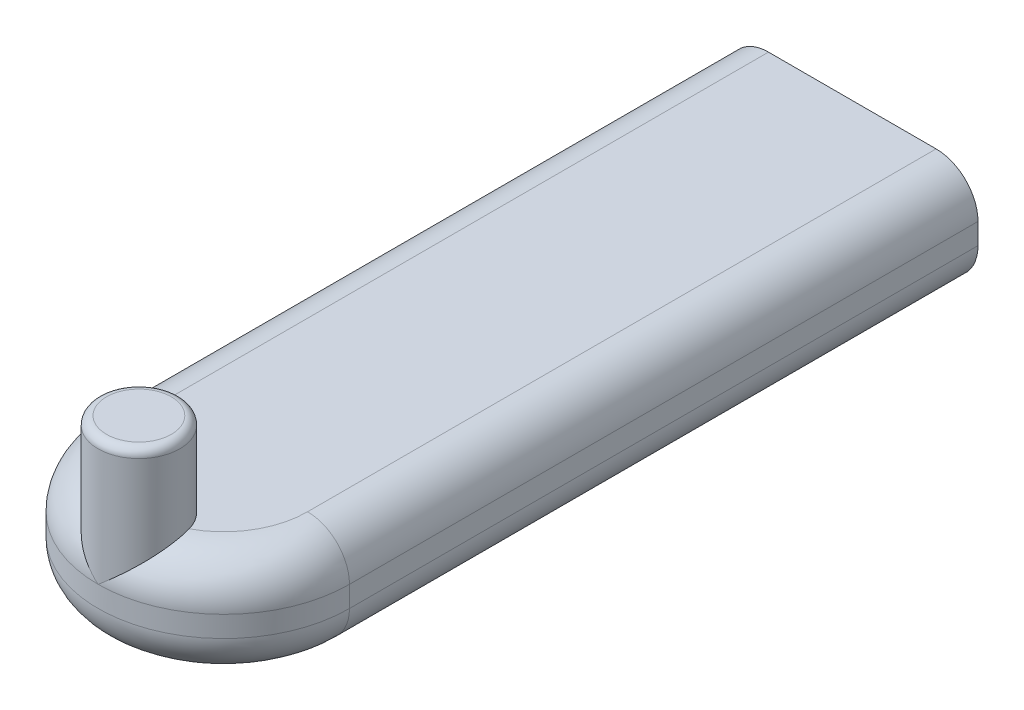
ISO-10303-21;
HEADER;
FILE_DESCRIPTION(('STEP AP214'),'2;1');
FILE_NAME('part.step','',(''),(''),'','','');
FILE_SCHEMA(('AUTOMOTIVE_DESIGN { 1 0 10303 214 1 1 1 1 }'));
ENDSEC;
DATA;
#1=APPLICATION_CONTEXT('core data for automotive mechanical design processes');
#2=APPLICATION_PROTOCOL_DEFINITION('international standard','automotive_design',2000,#1);
#3=PRODUCT_CONTEXT('',#1,'mechanical');
#4=PRODUCT('Part','Part','',(#3));
#5=PRODUCT_RELATED_PRODUCT_CATEGORY('part','',(#4));
#6=PRODUCT_DEFINITION_FORMATION('','',#4);
#7=PRODUCT_DEFINITION_CONTEXT('part definition',#1,'design');
#8=PRODUCT_DEFINITION('design','',#6,#7);
#9=PRODUCT_DEFINITION_SHAPE('','',#8);
#10=(LENGTH_UNIT() NAMED_UNIT(*) SI_UNIT(.MILLI.,.METRE.));
#11=(NAMED_UNIT(*) PLANE_ANGLE_UNIT() SI_UNIT($,.RADIAN.));
#12=(NAMED_UNIT(*) SI_UNIT($,.STERADIAN.) SOLID_ANGLE_UNIT());
#13=UNCERTAINTY_MEASURE_WITH_UNIT(LENGTH_MEASURE(1.E-05),#10,'distance_accuracy_value','');
#14=(GEOMETRIC_REPRESENTATION_CONTEXT(3) GLOBAL_UNCERTAINTY_ASSIGNED_CONTEXT((#13)) GLOBAL_UNIT_ASSIGNED_CONTEXT((#10,
#11,#12)) REPRESENTATION_CONTEXT('',''));
#15=CARTESIAN_POINT('',(0.,0.,0.));
#16=DIRECTION('',(0.,0.,1.));
#17=DIRECTION('',(1.,0.,0.));
#18=AXIS2_PLACEMENT_3D('',#15,#16,#17);
#19=CARTESIAN_POINT('',(0.,5.,0.));
#20=DIRECTION('',(0.,-1.,0.));
#21=DIRECTION('',(0.,0.,-1.));
#22=AXIS2_PLACEMENT_3D('',#19,#20,#21);
#23=CYLINDRICAL_SURFACE('',#22,6.);
#24=DIRECTION('',(0.,-1.,0.));
#25=VECTOR('',#24,1.);
#26=CARTESIAN_POINT('',(-6.,5.,0.));
#27=LINE('',#26,#25);
#28=CARTESIAN_POINT('',(-6.,3.,0.));
#29=VERTEX_POINT('',#28);
#30=CARTESIAN_POINT('',(-6.,2.,0.));
#31=VERTEX_POINT('',#30);
#32=EDGE_CURVE('E250',#29,#31,#27,.T.);
#33=ORIENTED_EDGE('',*,*,#32,.T.);
#34=CARTESIAN_POINT('',(0.,2.,0.));
#35=DIRECTION('',(0.,1.,0.));
#36=DIRECTION('',(0.,0.,1.));
#37=AXIS2_PLACEMENT_3D('',#34,#35,#36);
#38=CIRCLE('',#37,6.);
#39=CARTESIAN_POINT('',(6.,2.,0.));
#40=VERTEX_POINT('',#39);
#41=EDGE_CURVE('E128',#31,#40,#38,.T.);
#42=ORIENTED_EDGE('',*,*,#41,.T.);
#43=DIRECTION('',(0.,-1.,0.));
#44=VECTOR('',#43,1.);
#45=CARTESIAN_POINT('',(6.,5.,0.));
#46=LINE('',#45,#44);
#47=CARTESIAN_POINT('',(6.,3.,0.));
#48=VERTEX_POINT('',#47);
#49=EDGE_CURVE('E116',#48,#40,#46,.T.);
#50=ORIENTED_EDGE('',*,*,#49,.F.);
#51=CARTESIAN_POINT('',(0.,3.,0.));
#52=DIRECTION('',(0.,1.,0.));
#53=DIRECTION('',(0.,0.,1.));
#54=AXIS2_PLACEMENT_3D('',#51,#52,#53);
#55=CIRCLE('',#54,6.);
#56=CARTESIAN_POINT('',(0.,3.,6.));
#57=VERTEX_POINT('',#56);
#58=EDGE_CURVE('E129',#48,#57,#55,.F.);
#59=ORIENTED_EDGE('',*,*,#58,.T.);
#60=CARTESIAN_POINT('',(0.,3.,0.));
#61=DIRECTION('',(0.,1.,0.));
#62=DIRECTION('',(0.,0.,1.));
#63=AXIS2_PLACEMENT_3D('',#60,#61,#62);
#64=CIRCLE('',#63,6.);
#65=EDGE_CURVE('E143',#57,#29,#64,.F.);
#66=ORIENTED_EDGE('',*,*,#65,.T.);
#67=EDGE_LOOP('',(#33,#42,#50,#59,#66));
#68=FACE_BOUND('',#67,.T.);
#69=ADVANCED_FACE('F39',(#68),#23,.T.);
#70=CARTESIAN_POINT('',(6.,5.,0.));
#71=DIRECTION('',(-1.,0.,0.));
#72=DIRECTION('',(0.,0.,1.));
#73=AXIS2_PLACEMENT_3D('',#70,#71,#72);
#74=PLANE('',#73);
#75=ORIENTED_EDGE('',*,*,#49,.T.);
#76=DIRECTION('',(0.,0.,-1.));
#77=VECTOR('',#76,1.);
#78=CARTESIAN_POINT('',(6.,2.,0.));
#79=LINE('',#78,#77);
#80=CARTESIAN_POINT('',(6.,2.,-30.));
#81=VERTEX_POINT('',#80);
#82=EDGE_CURVE('E53',#40,#81,#79,.T.);
#83=ORIENTED_EDGE('',*,*,#82,.T.);
#84=DIRECTION('',(0.,-1.,0.));
#85=VECTOR('',#84,1.);
#86=CARTESIAN_POINT('',(6.,5.,-30.));
#87=LINE('',#86,#85);
#88=CARTESIAN_POINT('',(6.,3.,-30.));
#89=VERTEX_POINT('',#88);
#90=EDGE_CURVE('E120',#89,#81,#87,.T.);
#91=ORIENTED_EDGE('',*,*,#90,.F.);
#92=DIRECTION('',(0.,0.,-1.));
#93=VECTOR('',#92,1.);
#94=CARTESIAN_POINT('',(6.,3.,0.));
#95=LINE('',#94,#93);
#96=EDGE_CURVE('E113',#89,#48,#95,.F.);
#97=ORIENTED_EDGE('',*,*,#96,.T.);
#98=EDGE_LOOP('',(#75,#83,#91,#97));
#99=FACE_BOUND('',#98,.T.);
#100=ADVANCED_FACE('F114',(#99),#74,.F.);
#101=CARTESIAN_POINT('',(-6.,5.,-30.));
#102=DIRECTION('',(0.,0.,1.));
#103=DIRECTION('',(1.,0.,0.));
#104=AXIS2_PLACEMENT_3D('',#101,#102,#103);
#105=PLANE('',#104);
#106=CARTESIAN_POINT('',(0.,2.5,-30.));
#107=DIRECTION('',(0.,0.,-1.));
#108=DIRECTION('',(-1.,0.,0.));
#109=AXIS2_PLACEMENT_3D('',#106,#107,#108);
#110=CIRCLE('',#109,1.95);
#111=CARTESIAN_POINT('',(-1.95,2.5,-30.));
#112=VERTEX_POINT('',#111);
#113=EDGE_CURVE('E249',#112,#112,#110,.T.);
#114=ORIENTED_EDGE('',*,*,#113,.F.);
#115=EDGE_LOOP('',(#114));
#116=FACE_BOUND('',#115,.T.);
#117=DIRECTION('',(0.,-1.,0.));
#118=VECTOR('',#117,1.);
#119=CARTESIAN_POINT('',(-6.,5.,-30.));
#120=LINE('',#119,#118);
#121=CARTESIAN_POINT('',(-6.,3.,-30.));
#122=VERTEX_POINT('',#121);
#123=CARTESIAN_POINT('',(-6.,2.,-30.));
#124=VERTEX_POINT('',#123);
#125=EDGE_CURVE('E253',#122,#124,#120,.T.);
#126=ORIENTED_EDGE('',*,*,#125,.F.);
#127=CARTESIAN_POINT('',(-4.,3.,-30.));
#128=DIRECTION('',(0.,0.,1.));
#129=DIRECTION('',(1.,0.,0.));
#130=AXIS2_PLACEMENT_3D('',#127,#128,#129);
#131=CIRCLE('',#130,2.);
#132=CARTESIAN_POINT('',(-4.,5.,-30.));
#133=VERTEX_POINT('',#132);
#134=EDGE_CURVE('E119',#122,#133,#131,.F.);
#135=ORIENTED_EDGE('',*,*,#134,.T.);
#136=DIRECTION('',(-1.,0.,0.));
#137=VECTOR('',#136,1.);
#138=CARTESIAN_POINT('',(-6.,5.,-30.));
#139=LINE('',#138,#137);
#140=CARTESIAN_POINT('',(4.,5.,-30.));
#141=VERTEX_POINT('',#140);
#142=EDGE_CURVE('E243',#141,#133,#139,.T.);
#143=ORIENTED_EDGE('',*,*,#142,.F.);
#144=CARTESIAN_POINT('',(4.,3.,-30.));
#145=DIRECTION('',(0.,0.,1.));
#146=DIRECTION('',(1.,0.,0.));
#147=AXIS2_PLACEMENT_3D('',#144,#145,#146);
#148=CIRCLE('',#147,2.);
#149=EDGE_CURVE('E64',#141,#89,#148,.F.);
#150=ORIENTED_EDGE('',*,*,#149,.T.);
#151=ORIENTED_EDGE('',*,*,#90,.T.);
#152=CARTESIAN_POINT('',(4.,2.,-30.));
#153=DIRECTION('',(0.,0.,1.));
#154=DIRECTION('',(1.,0.,0.));
#155=AXIS2_PLACEMENT_3D('',#152,#153,#154);
#156=CIRCLE('',#155,2.);
#157=CARTESIAN_POINT('',(4.,0.,-30.));
#158=VERTEX_POINT('',#157);
#159=EDGE_CURVE('E167',#81,#158,#156,.F.);
#160=ORIENTED_EDGE('',*,*,#159,.T.);
#161=DIRECTION('',(-1.,0.,0.));
#162=VECTOR('',#161,1.);
#163=CARTESIAN_POINT('',(-6.,0.,-30.));
#164=LINE('',#163,#162);
#165=CARTESIAN_POINT('',(-4.,0.,-30.));
#166=VERTEX_POINT('',#165);
#167=EDGE_CURVE('E240',#158,#166,#164,.T.);
#168=ORIENTED_EDGE('',*,*,#167,.T.);
#169=CARTESIAN_POINT('',(-4.,2.,-30.));
#170=DIRECTION('',(0.,0.,1.));
#171=DIRECTION('',(1.,0.,0.));
#172=AXIS2_PLACEMENT_3D('',#169,#170,#171);
#173=CIRCLE('',#172,2.);
#174=EDGE_CURVE('E175',#166,#124,#173,.F.);
#175=ORIENTED_EDGE('',*,*,#174,.T.);
#176=EDGE_LOOP('',(#126,#135,#143,#150,#151,#160,#168,#175));
#177=FACE_BOUND('',#176,.T.);
#178=ADVANCED_FACE('F222',(#116,#177),#105,.F.);
#179=CARTESIAN_POINT('',(-6.,5.,0.));
#180=DIRECTION('',(1.,0.,0.));
#181=DIRECTION('',(0.,0.,-1.));
#182=AXIS2_PLACEMENT_3D('',#179,#180,#181);
#183=PLANE('',#182);
#184=ORIENTED_EDGE('',*,*,#32,.F.);
#185=DIRECTION('',(0.,0.,1.));
#186=VECTOR('',#185,1.);
#187=CARTESIAN_POINT('',(-6.,3.,-30.));
#188=LINE('',#187,#186);
#189=EDGE_CURVE('E170',#29,#122,#188,.F.);
#190=ORIENTED_EDGE('',*,*,#189,.T.);
#191=ORIENTED_EDGE('',*,*,#125,.T.);
#192=DIRECTION('',(0.,0.,1.));
#193=VECTOR('',#192,1.);
#194=CARTESIAN_POINT('',(-6.,2.,0.));
#195=LINE('',#194,#193);
#196=EDGE_CURVE('E164',#124,#31,#195,.T.);
#197=ORIENTED_EDGE('',*,*,#196,.T.);
#198=EDGE_LOOP('',(#184,#190,#191,#197));
#199=FACE_BOUND('',#198,.T.);
#200=ADVANCED_FACE('F257',(#199),#183,.F.);
#201=CARTESIAN_POINT('',(0.,5.,0.));
#202=DIRECTION('',(0.,1.,0.));
#203=DIRECTION('',(0.,0.,1.));
#204=AXIS2_PLACEMENT_3D('',#201,#202,#203);
#205=PLANE('',#204);
#206=DIRECTION('',(0.,0.,1.));
#207=VECTOR('',#206,1.);
#208=CARTESIAN_POINT('',(-4.,5.,0.));
#209=LINE('',#208,#207);
#210=CARTESIAN_POINT('',(-4.,5.,0.));
#211=VERTEX_POINT('',#210);
#212=EDGE_CURVE('E158',#133,#211,#209,.T.);
#213=ORIENTED_EDGE('',*,*,#212,.T.);
#214=CARTESIAN_POINT('',(0.,5.,0.));
#215=DIRECTION('',(0.,1.,0.));
#216=DIRECTION('',(0.,0.,1.));
#217=AXIS2_PLACEMENT_3D('',#214,#215,#216);
#218=CIRCLE('',#217,4.);
#219=CARTESIAN_POINT('',(-1.87962709562156,5.,3.53086419753087));
#220=VERTEX_POINT('',#219);
#221=EDGE_CURVE('E162',#211,#220,#218,.T.);
#222=ORIENTED_EDGE('',*,*,#221,.T.);
#223=CARTESIAN_POINT('',(0.,5.,4.05));
#224=DIRECTION('',(0.,1.,0.));
#225=DIRECTION('',(0.,0.,1.));
#226=AXIS2_PLACEMENT_3D('',#223,#224,#225);
#227=CIRCLE('',#226,1.95);
#228=CARTESIAN_POINT('',(1.87962709562156,5.,3.53086419753087));
#229=VERTEX_POINT('',#228);
#230=EDGE_CURVE('E267',#229,#220,#227,.T.);
#231=ORIENTED_EDGE('',*,*,#230,.F.);
#232=CARTESIAN_POINT('',(0.,5.,0.));
#233=DIRECTION('',(0.,1.,0.));
#234=DIRECTION('',(0.,0.,1.));
#235=AXIS2_PLACEMENT_3D('',#232,#233,#234);
#236=CIRCLE('',#235,4.);
#237=CARTESIAN_POINT('',(4.,5.,0.));
#238=VERTEX_POINT('',#237);
#239=EDGE_CURVE('E159',#229,#238,#236,.T.);
#240=ORIENTED_EDGE('',*,*,#239,.T.);
#241=DIRECTION('',(0.,0.,-1.));
#242=VECTOR('',#241,1.);
#243=CARTESIAN_POINT('',(4.,5.,-30.));
#244=LINE('',#243,#242);
#245=EDGE_CURVE('E135',#238,#141,#244,.T.);
#246=ORIENTED_EDGE('',*,*,#245,.T.);
#247=ORIENTED_EDGE('',*,*,#142,.T.);
#248=EDGE_LOOP('',(#213,#222,#231,#240,#246,#247));
#249=FACE_BOUND('',#248,.T.);
#250=ADVANCED_FACE('F276',(#249),#205,.T.);
#251=CARTESIAN_POINT('',(0.,0.,0.));
#252=DIRECTION('',(0.,1.,0.));
#253=DIRECTION('',(0.,0.,1.));
#254=AXIS2_PLACEMENT_3D('',#251,#252,#253);
#255=PLANE('',#254);
#256=CARTESIAN_POINT('',(0.,0.,0.));
#257=DIRECTION('',(0.,1.,0.));
#258=DIRECTION('',(0.,0.,1.));
#259=AXIS2_PLACEMENT_3D('',#256,#257,#258);
#260=CIRCLE('',#259,4.);
#261=CARTESIAN_POINT('',(4.,0.,0.));
#262=VERTEX_POINT('',#261);
#263=CARTESIAN_POINT('',(-4.,0.,0.));
#264=VERTEX_POINT('',#263);
#265=EDGE_CURVE('E154',#262,#264,#260,.F.);
#266=ORIENTED_EDGE('',*,*,#265,.T.);
#267=DIRECTION('',(0.,0.,1.));
#268=VECTOR('',#267,1.);
#269=CARTESIAN_POINT('',(-4.,0.,0.));
#270=LINE('',#269,#268);
#271=EDGE_CURVE('E155',#264,#166,#270,.F.);
#272=ORIENTED_EDGE('',*,*,#271,.T.);
#273=ORIENTED_EDGE('',*,*,#167,.F.);
#274=DIRECTION('',(0.,0.,-1.));
#275=VECTOR('',#274,1.);
#276=CARTESIAN_POINT('',(4.,0.,0.));
#277=LINE('',#276,#275);
#278=EDGE_CURVE('E151',#158,#262,#277,.F.);
#279=ORIENTED_EDGE('',*,*,#278,.T.);
#280=EDGE_LOOP('',(#266,#272,#273,#279));
#281=FACE_BOUND('',#280,.T.);
#282=ADVANCED_FACE('F239',(#281),#255,.F.);
#283=CARTESIAN_POINT('',(0.,2.5,-22.));
#284=DIRECTION('',(0.,0.,-1.));
#285=DIRECTION('',(-1.,0.,0.));
#286=AXIS2_PLACEMENT_3D('',#283,#284,#285);
#287=CYLINDRICAL_SURFACE('',#286,1.95);
#288=CARTESIAN_POINT('',(0.,2.5,-22.));
#289=DIRECTION('',(0.,0.,-1.));
#290=DIRECTION('',(-1.,0.,0.));
#291=AXIS2_PLACEMENT_3D('',#288,#289,#290);
#292=CIRCLE('',#291,1.95);
#293=CARTESIAN_POINT('',(-1.95,2.5,-22.));
#294=VERTEX_POINT('',#293);
#295=EDGE_CURVE('E242',#294,#294,#292,.T.);
#296=ORIENTED_EDGE('',*,*,#295,.F.);
#297=EDGE_LOOP('',(#296));
#298=FACE_BOUND('',#297,.T.);
#299=ORIENTED_EDGE('',*,*,#113,.T.);
#300=EDGE_LOOP('',(#299));
#301=FACE_BOUND('',#300,.T.);
#302=ADVANCED_FACE('F284',(#298,#301),#287,.F.);
#303=CARTESIAN_POINT('',(0.,2.5,-22.));
#304=DIRECTION('',(0.,0.,-1.));
#305=DIRECTION('',(-1.,0.,0.));
#306=AXIS2_PLACEMENT_3D('',#303,#304,#305);
#307=PLANE('',#306);
#308=ORIENTED_EDGE('',*,*,#295,.T.);
#309=EDGE_LOOP('',(#308));
#310=FACE_BOUND('',#309,.T.);
#311=ADVANCED_FACE('F298',(#310),#307,.T.);
#312=CARTESIAN_POINT('',(0.,9.,4.05));
#313=DIRECTION('',(0.,-1.,0.));
#314=DIRECTION('',(0.,0.,-1.));
#315=AXIS2_PLACEMENT_3D('',#312,#313,#314);
#316=CYLINDRICAL_SURFACE('',#315,1.95);
#317=CARTESIAN_POINT('',(0.,8.6,4.05));
#318=DIRECTION('',(0.,1.,0.));
#319=DIRECTION('',(0.,0.,1.));
#320=AXIS2_PLACEMENT_3D('',#317,#318,#319);
#321=CIRCLE('',#320,1.95);
#322=CARTESIAN_POINT('',(0.,8.6,6.));
#323=VERTEX_POINT('',#322);
#324=EDGE_CURVE('E11',#323,#323,#321,.F.);
#325=ORIENTED_EDGE('',*,*,#324,.T.);
#326=EDGE_LOOP('',(#325));
#327=FACE_BOUND('',#326,.T.);
#328=CARTESIAN_POINT('',(-1.87962709562155,5.,3.53086419753087));
#329=CARTESIAN_POINT('',(-1.89192676471954,5.00000650339603,3.57535692611797));
#330=CARTESIAN_POINT('',(-1.90262182989522,4.99847790735345,3.6202763668086));
#331=CARTESIAN_POINT('',(-1.92077299578989,4.99253679450393,3.71053443012862));
#332=CARTESIAN_POINT('',(-1.92823215561451,4.9881270113944,3.75587261528958));
#333=CARTESIAN_POINT('',(-1.93986215690746,4.97665152718441,3.84628557874887));
#334=CARTESIAN_POINT('',(-1.9440568095077,4.96960562378907,3.89135983809592));
#335=CARTESIAN_POINT('',(-1.94930775937668,4.95306679577695,3.9812366992444));
#336=CARTESIAN_POINT('',(-1.95036341084481,4.94357336805667,4.0260392432528));
#337=CARTESIAN_POINT('',(-1.94895183675902,4.91181943649524,4.15924012961636));
#338=CARTESIAN_POINT('',(-1.9419570476793,4.8862297059038,4.24684494077857));
#339=CARTESIAN_POINT('',(-1.91692082777807,4.82778758088373,4.41801048536963));
#340=CARTESIAN_POINT('',(-1.89885835942284,4.79492143155001,4.50156318933604));
#341=CARTESIAN_POINT('',(-1.85055299005459,4.71962685577034,4.67174496088571));
#342=CARTESIAN_POINT('',(-1.81923447867487,4.67655807734897,4.75778308892952));
#343=CARTESIAN_POINT('',(-1.74639598004237,4.58490607723211,4.92217875751705));
#344=CARTESIAN_POINT('',(-1.70487445682881,4.53632202586078,5.00053513916427));
#345=CARTESIAN_POINT('',(-1.60347589145328,4.42408008472292,5.16469068006584));
#346=CARTESIAN_POINT('',(-1.54157364611945,4.35940993007335,5.24854686504831));
#347=CARTESIAN_POINT('',(-1.40759774653239,4.2253991787361,5.40339124482565));
#348=CARTESIAN_POINT('',(-1.33551692452404,4.15605530896066,5.47437029036314));
#349=CARTESIAN_POINT('',(-1.16834808042009,3.99991225387416,5.61578760421424));
#350=CARTESIAN_POINT('',(-1.07152642660848,3.91236809863689,5.68335732279572));
#351=CARTESIAN_POINT('',(-0.869689982041716,3.73396624455038,5.79919775711214));
#352=CARTESIAN_POINT('',(-0.764669144017781,3.64310612683923,5.84745406452803));
#353=CARTESIAN_POINT('',(-0.552120293671413,3.46169605045028,5.92352311735508));
#354=CARTESIAN_POINT('',(-0.444720452877045,3.37119504580527,5.95181645254583));
#355=CARTESIAN_POINT('',(-0.227598812969001,3.18938806803198,5.98979608619865));
#356=CARTESIAN_POINT('',(-0.117881812565629,3.09808395074779,5.99951763098603));
#357=CARTESIAN_POINT('',(-0.00550882270391651,3.00458361761043,5.99999417263307));
#358=CARTESIAN_POINT('',(-0.00275436947316972,3.00229177397208,6.00000000882646));
#359=CARTESIAN_POINT('',(0.,3.,6.));
#360=B_SPLINE_CURVE_WITH_KNOTS('',3,(#328,#329,#330,#331,#332,#333,#334,#335,#336,#337,#338,
#339,#340,#341,#342,#343,#344,#345,#346,#347,#348,#349,#350,#351,#352,#353,#354,#355,#356,#357,
#358,#359),.UNSPECIFIED.,.F.,.F.,(4,2,2,2,2,2,2,2,2,2,2,2,2,2,2,4),(0.,0.13840544853571,
0.276679767009072,0.413935813626134,0.551220096583962,0.824544721529186,1.09839050275896,
1.40085322755388,1.70336151299358,2.06999209530204,2.43688215851113,2.87614462585169,
3.3157341865676,3.74434227457976,4.17213612087901,4.18288581213461),.UNSPECIFIED.);
#361=EDGE_CURVE('E176',#220,#57,#360,.T.);
#362=ORIENTED_EDGE('',*,*,#361,.T.);
#363=CARTESIAN_POINT('',(1.87962709562156,5.,3.53086419753087));
#364=CARTESIAN_POINT('',(1.89192676471954,5.00000650339603,3.57535692611797));
#365=CARTESIAN_POINT('',(1.90262182989522,4.99847790735345,3.62027636680859));
#366=CARTESIAN_POINT('',(1.92077299578989,4.99253679450393,3.71053443012862));
#367=CARTESIAN_POINT('',(1.92823215561451,4.9881270113944,3.75587261528958));
#368=CARTESIAN_POINT('',(1.93986215690746,4.97665152718441,3.84628557874887));
#369=CARTESIAN_POINT('',(1.9440568095077,4.96960562378907,3.89135983809592));
#370=CARTESIAN_POINT('',(1.94930775937668,4.95306679577695,3.9812366992444));
#371=CARTESIAN_POINT('',(1.95036341084481,4.94357336805667,4.0260392432528));
#372=CARTESIAN_POINT('',(1.94895183675902,4.91181943649524,4.15924012961636));
#373=CARTESIAN_POINT('',(1.9419570476793,4.8862297059038,4.24684494077857));
#374=CARTESIAN_POINT('',(1.91692082777807,4.82778758088373,4.41801048536963));
#375=CARTESIAN_POINT('',(1.89885835942284,4.79492143155001,4.50156318933604));
#376=CARTESIAN_POINT('',(1.85055299005459,4.71962685577034,4.6717449608857));
#377=CARTESIAN_POINT('',(1.81923447867487,4.67655807734897,4.75778308892952));
#378=CARTESIAN_POINT('',(1.74639598004237,4.58490607723211,4.92217875751705));
#379=CARTESIAN_POINT('',(1.70487445682881,4.53632202586079,5.00053513916427));
#380=CARTESIAN_POINT('',(1.60347589145328,4.42408008472292,5.16469068006584));
#381=CARTESIAN_POINT('',(1.54157364611945,4.35940993007335,5.24854686504831));
#382=CARTESIAN_POINT('',(1.40759774653239,4.2253991787361,5.40339124482565));
#383=CARTESIAN_POINT('',(1.33551692452404,4.15605530896066,5.47437029036314));
#384=CARTESIAN_POINT('',(1.16834808042009,3.99991225387416,5.61578760421424));
#385=CARTESIAN_POINT('',(1.07152642660848,3.91236809863689,5.68335732279572));
#386=CARTESIAN_POINT('',(0.869689982041717,3.73396624455038,5.79919775711214));
#387=CARTESIAN_POINT('',(0.764669144017782,3.64310612683923,5.84745406452803));
#388=CARTESIAN_POINT('',(0.552120293671414,3.46169605045028,5.92352311735508));
#389=CARTESIAN_POINT('',(0.444720452877045,3.37119504580527,5.95181645254583));
#390=CARTESIAN_POINT('',(0.227598812969002,3.18938806803198,5.98979608619865));
#391=CARTESIAN_POINT('',(0.117881812565629,3.09808395074779,5.99951763098603));
#392=CARTESIAN_POINT('',(0.00550882270391647,3.00458361761043,5.99999417263307));
#393=CARTESIAN_POINT('',(0.0027543694731697,3.00229177397208,6.00000000882646));
#394=CARTESIAN_POINT('',(0.,3.,6.));
#395=B_SPLINE_CURVE_WITH_KNOTS('',3,(#363,#364,#365,#366,#367,#368,#369,#370,#371,#372,#373,
#374,#375,#376,#377,#378,#379,#380,#381,#382,#383,#384,#385,#386,#387,#388,#389,#390,#391,#392,
#393,#394),.UNSPECIFIED.,.F.,.F.,(4,2,2,2,2,2,2,2,2,2,2,2,2,2,2,4),(0.,0.13840544853571,
0.276679767009072,0.413935813626134,0.551220096583961,0.824544721529185,1.09839050275896,
1.40085322755388,1.70336151299358,2.06999209530204,2.43688215851113,2.87614462585168,
3.3157341865676,3.74434227457976,4.17213612087901,4.18288581213461),.UNSPECIFIED.);
#396=EDGE_CURVE('E141',#57,#229,#395,.F.);
#397=ORIENTED_EDGE('',*,*,#396,.T.);
#398=ORIENTED_EDGE('',*,*,#230,.T.);
#399=EDGE_LOOP('',(#362,#397,#398));
#400=FACE_BOUND('',#399,.T.);
#401=ADVANCED_FACE('F188',(#327,#400),#316,.T.);
#402=CARTESIAN_POINT('',(0.,9.,4.05));
#403=DIRECTION('',(0.,1.,0.));
#404=DIRECTION('',(0.,0.,1.));
#405=AXIS2_PLACEMENT_3D('',#402,#403,#404);
#406=PLANE('',#405);
#407=CARTESIAN_POINT('',(0.,9.,4.05));
#408=DIRECTION('',(0.,1.,0.));
#409=DIRECTION('',(0.,0.,1.));
#410=AXIS2_PLACEMENT_3D('',#407,#408,#409);
#411=CIRCLE('',#410,1.55);
#412=CARTESIAN_POINT('',(0.,9.,5.6));
#413=VERTEX_POINT('',#412);
#414=EDGE_CURVE('E50',#413,#413,#411,.T.);
#415=ORIENTED_EDGE('',*,*,#414,.T.);
#416=EDGE_LOOP('',(#415));
#417=FACE_BOUND('',#416,.T.);
#418=ADVANCED_FACE('F230',(#417),#406,.T.);
#419=CARTESIAN_POINT('',(-4.,2.,0.));
#420=DIRECTION('',(0.,0.,1.));
#421=DIRECTION('',(1.,0.,0.));
#422=AXIS2_PLACEMENT_3D('',#419,#420,#421);
#423=CYLINDRICAL_SURFACE('',#422,2.);
#424=ORIENTED_EDGE('',*,*,#174,.F.);
#425=ORIENTED_EDGE('',*,*,#271,.F.);
#426=CARTESIAN_POINT('',(-4.,2.,0.));
#427=DIRECTION('',(0.,0.,1.));
#428=DIRECTION('',(1.,0.,0.));
#429=AXIS2_PLACEMENT_3D('',#426,#427,#428);
#430=CIRCLE('',#429,2.);
#431=EDGE_CURVE('E265',#31,#264,#430,.T.);
#432=ORIENTED_EDGE('',*,*,#431,.F.);
#433=ORIENTED_EDGE('',*,*,#196,.F.);
#434=EDGE_LOOP('',(#424,#425,#432,#433));
#435=FACE_BOUND('',#434,.T.);
#436=ADVANCED_FACE('F198',(#435),#423,.T.);
#437=CARTESIAN_POINT('',(4.,2.,0.));
#438=DIRECTION('',(0.,0.,-1.));
#439=DIRECTION('',(-1.,0.,0.));
#440=AXIS2_PLACEMENT_3D('',#437,#438,#439);
#441=CYLINDRICAL_SURFACE('',#440,2.);
#442=ORIENTED_EDGE('',*,*,#159,.F.);
#443=ORIENTED_EDGE('',*,*,#82,.F.);
#444=CARTESIAN_POINT('',(4.,2.,0.));
#445=DIRECTION('',(0.,0.,1.));
#446=DIRECTION('',(1.,0.,0.));
#447=AXIS2_PLACEMENT_3D('',#444,#445,#446);
#448=CIRCLE('',#447,2.);
#449=EDGE_CURVE('E139',#262,#40,#448,.T.);
#450=ORIENTED_EDGE('',*,*,#449,.F.);
#451=ORIENTED_EDGE('',*,*,#278,.F.);
#452=EDGE_LOOP('',(#442,#443,#450,#451));
#453=FACE_BOUND('',#452,.T.);
#454=ADVANCED_FACE('F211',(#453),#441,.T.);
#455=CARTESIAN_POINT('',(0.,2.,0.));
#456=DIRECTION('',(0.,1.,0.));
#457=DIRECTION('',(0.,0.,1.));
#458=AXIS2_PLACEMENT_3D('',#455,#456,#457);
#459=TOROIDAL_SURFACE('',#458,4.,2.);
#460=ORIENTED_EDGE('',*,*,#431,.T.);
#461=ORIENTED_EDGE('',*,*,#265,.F.);
#462=ORIENTED_EDGE('',*,*,#449,.T.);
#463=ORIENTED_EDGE('',*,*,#41,.F.);
#464=EDGE_LOOP('',(#460,#461,#462,#463));
#465=FACE_BOUND('',#464,.T.);
#466=ADVANCED_FACE('F206',(#465),#459,.T.);
#467=CARTESIAN_POINT('',(4.,3.,0.));
#468=DIRECTION('',(0.,0.,1.));
#469=DIRECTION('',(1.,0.,0.));
#470=AXIS2_PLACEMENT_3D('',#467,#468,#469);
#471=CYLINDRICAL_SURFACE('',#470,2.);
#472=ORIENTED_EDGE('',*,*,#149,.F.);
#473=ORIENTED_EDGE('',*,*,#245,.F.);
#474=CARTESIAN_POINT('',(4.,3.,0.));
#475=DIRECTION('',(0.,0.,1.));
#476=DIRECTION('',(1.,0.,0.));
#477=AXIS2_PLACEMENT_3D('',#474,#475,#476);
#478=CIRCLE('',#477,2.);
#479=EDGE_CURVE('E134',#48,#238,#478,.T.);
#480=ORIENTED_EDGE('',*,*,#479,.F.);
#481=ORIENTED_EDGE('',*,*,#96,.F.);
#482=EDGE_LOOP('',(#472,#473,#480,#481));
#483=FACE_BOUND('',#482,.T.);
#484=ADVANCED_FACE('F133',(#483),#471,.T.);
#485=CARTESIAN_POINT('',(-4.,3.,0.));
#486=DIRECTION('',(0.,0.,-1.));
#487=DIRECTION('',(-1.,0.,0.));
#488=AXIS2_PLACEMENT_3D('',#485,#486,#487);
#489=CYLINDRICAL_SURFACE('',#488,2.);
#490=ORIENTED_EDGE('',*,*,#134,.F.);
#491=ORIENTED_EDGE('',*,*,#189,.F.);
#492=CARTESIAN_POINT('',(-4.,3.,0.));
#493=DIRECTION('',(0.,0.,1.));
#494=DIRECTION('',(1.,0.,0.));
#495=AXIS2_PLACEMENT_3D('',#492,#493,#494);
#496=CIRCLE('',#495,2.);
#497=EDGE_CURVE('E136',#211,#29,#496,.T.);
#498=ORIENTED_EDGE('',*,*,#497,.F.);
#499=ORIENTED_EDGE('',*,*,#212,.F.);
#500=EDGE_LOOP('',(#490,#491,#498,#499));
#501=FACE_BOUND('',#500,.T.);
#502=ADVANCED_FACE('F201',(#501),#489,.T.);
#503=CARTESIAN_POINT('',(0.,3.,0.));
#504=DIRECTION('',(0.,1.,0.));
#505=DIRECTION('',(0.,0.,1.));
#506=AXIS2_PLACEMENT_3D('',#503,#504,#505);
#507=TOROIDAL_SURFACE('',#506,4.,2.);
#508=ORIENTED_EDGE('',*,*,#239,.F.);
#509=ORIENTED_EDGE('',*,*,#396,.F.);
#510=ORIENTED_EDGE('',*,*,#58,.F.);
#511=ORIENTED_EDGE('',*,*,#479,.T.);
#512=EDGE_LOOP('',(#508,#509,#510,#511));
#513=FACE_BOUND('',#512,.T.);
#514=ADVANCED_FACE('F145',(#513),#507,.T.);
#515=CARTESIAN_POINT('',(0.,3.,0.));
#516=DIRECTION('',(0.,1.,0.));
#517=DIRECTION('',(0.,0.,1.));
#518=AXIS2_PLACEMENT_3D('',#515,#516,#517);
#519=TOROIDAL_SURFACE('',#518,4.,2.);
#520=ORIENTED_EDGE('',*,*,#497,.T.);
#521=ORIENTED_EDGE('',*,*,#65,.F.);
#522=ORIENTED_EDGE('',*,*,#361,.F.);
#523=ORIENTED_EDGE('',*,*,#221,.F.);
#524=EDGE_LOOP('',(#520,#521,#522,#523));
#525=FACE_BOUND('',#524,.T.);
#526=ADVANCED_FACE('F193',(#525),#519,.T.);
#527=CARTESIAN_POINT('',(0.,8.6,4.05));
#528=DIRECTION('',(0.,1.,0.));
#529=DIRECTION('',(0.,0.,1.));
#530=AXIS2_PLACEMENT_3D('',#527,#528,#529);
#531=TOROIDAL_SURFACE('',#530,1.55,0.4);
#532=ORIENTED_EDGE('',*,*,#324,.F.);
#533=EDGE_LOOP('',(#532));
#534=FACE_BOUND('',#533,.T.);
#535=ORIENTED_EDGE('',*,*,#414,.F.);
#536=EDGE_LOOP('',(#535));
#537=FACE_BOUND('',#536,.T.);
#538=ADVANCED_FACE('F41',(#534,#537),#531,.T.);
#539=CLOSED_SHELL('',(#69,#100,#178,#200,#250,#282,#302,#311,#401,#418,#436,#454,#466,#484,#502,
#514,#526,#538));
#540=MANIFOLD_SOLID_BREP('B2',#539);
#541=ADVANCED_BREP_SHAPE_REPRESENTATION('',(#18,#540),#14);
#542=SHAPE_DEFINITION_REPRESENTATION(#9,#541);
ENDSEC;
END-ISO-10303-21;
